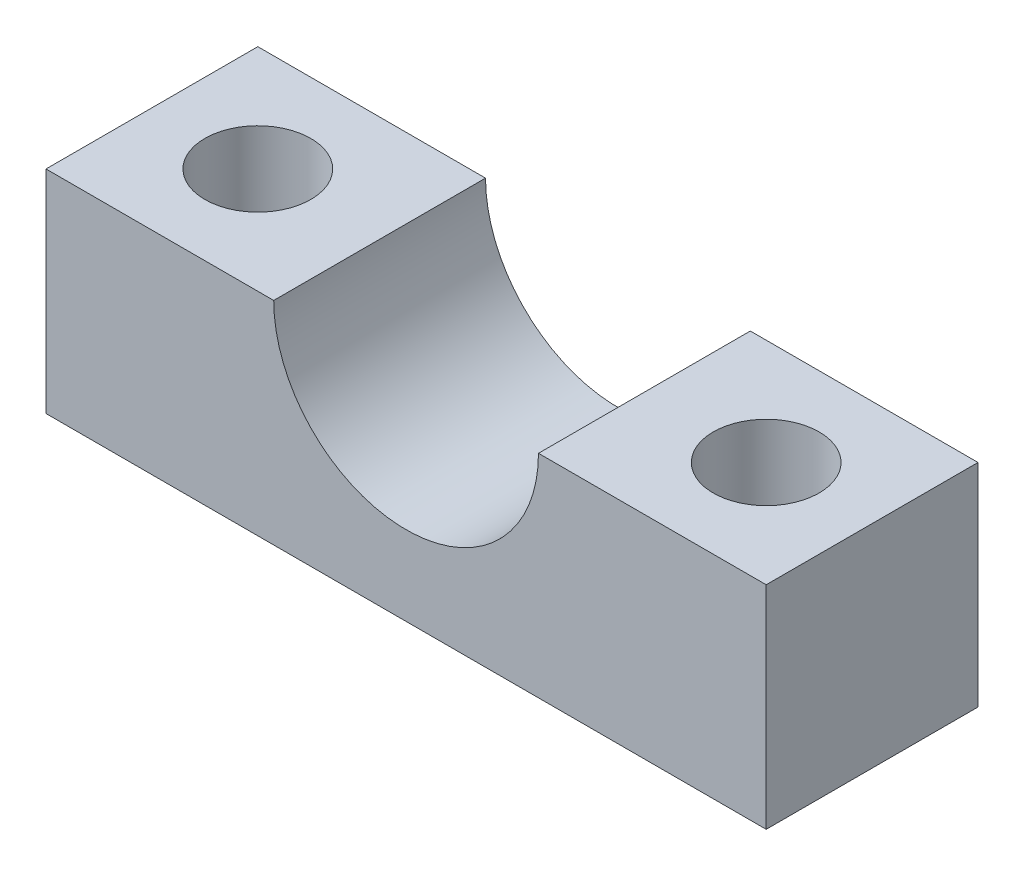
ISO-10303-21;
HEADER;
FILE_DESCRIPTION(('STEP AP214'),'2;1');
FILE_NAME('part.step','',(''),(''),'','','');
FILE_SCHEMA(('AUTOMOTIVE_DESIGN { 1 0 10303 214 1 1 1 1 }'));
ENDSEC;
DATA;
#1=APPLICATION_CONTEXT('core data for automotive mechanical design processes');
#2=APPLICATION_PROTOCOL_DEFINITION('international standard','automotive_design',2000,#1);
#3=PRODUCT_CONTEXT('',#1,'mechanical');
#4=PRODUCT('Part','Part','',(#3));
#5=PRODUCT_RELATED_PRODUCT_CATEGORY('part','',(#4));
#6=PRODUCT_DEFINITION_FORMATION('','',#4);
#7=PRODUCT_DEFINITION_CONTEXT('part definition',#1,'design');
#8=PRODUCT_DEFINITION('design','',#6,#7);
#9=PRODUCT_DEFINITION_SHAPE('','',#8);
#10=(LENGTH_UNIT() NAMED_UNIT(*) SI_UNIT(.MILLI.,.METRE.));
#11=(NAMED_UNIT(*) PLANE_ANGLE_UNIT() SI_UNIT($,.RADIAN.));
#12=(NAMED_UNIT(*) SI_UNIT($,.STERADIAN.) SOLID_ANGLE_UNIT());
#13=UNCERTAINTY_MEASURE_WITH_UNIT(LENGTH_MEASURE(1.E-05),#10,'distance_accuracy_value','');
#14=(GEOMETRIC_REPRESENTATION_CONTEXT(3) GLOBAL_UNCERTAINTY_ASSIGNED_CONTEXT((#13)) GLOBAL_UNIT_ASSIGNED_CONTEXT((#10,
#11,#12)) REPRESENTATION_CONTEXT('',''));
#15=CARTESIAN_POINT('',(0.,0.,0.));
#16=DIRECTION('',(0.,0.,1.));
#17=DIRECTION('',(1.,0.,0.));
#18=AXIS2_PLACEMENT_3D('',#15,#16,#17);
#19=CARTESIAN_POINT('',(0.,12.7,0.));
#20=DIRECTION('',(0.,1.,0.));
#21=DIRECTION('',(0.,0.,1.));
#22=AXIS2_PLACEMENT_3D('',#19,#20,#21);
#23=PLANE('',#22);
#24=DIRECTION('',(0.,0.,1.));
#25=VECTOR('',#24,1.);
#26=CARTESIAN_POINT('',(-7.9375,12.7,-6.35));
#27=LINE('',#26,#25);
#28=CARTESIAN_POINT('',(-7.9375,12.7,-6.35));
#29=VERTEX_POINT('',#28);
#30=CARTESIAN_POINT('',(-7.9375,12.7,6.35));
#31=VERTEX_POINT('',#30);
#32=EDGE_CURVE('E101',#29,#31,#27,.T.);
#33=ORIENTED_EDGE('',*,*,#32,.F.);
#34=DIRECTION('',(-1.,0.,0.));
#35=VECTOR('',#34,1.);
#36=CARTESIAN_POINT('',(21.59,12.7,-6.35));
#37=LINE('',#36,#35);
#38=CARTESIAN_POINT('',(-21.59,12.7,-6.35));
#39=VERTEX_POINT('',#38);
#40=EDGE_CURVE('E62',#29,#39,#37,.T.);
#41=ORIENTED_EDGE('',*,*,#40,.T.);
#42=DIRECTION('',(0.,0.,1.));
#43=VECTOR('',#42,1.);
#44=CARTESIAN_POINT('',(-21.59,12.7,6.35));
#45=LINE('',#44,#43);
#46=CARTESIAN_POINT('',(-21.59,12.7,6.35));
#47=VERTEX_POINT('',#46);
#48=EDGE_CURVE('E125',#39,#47,#45,.T.);
#49=ORIENTED_EDGE('',*,*,#48,.T.);
#50=DIRECTION('',(1.,0.,0.));
#51=VECTOR('',#50,1.);
#52=CARTESIAN_POINT('',(21.59,12.7,6.35));
#53=LINE('',#52,#51);
#54=EDGE_CURVE('E92',#47,#31,#53,.T.);
#55=ORIENTED_EDGE('',*,*,#54,.T.);
#56=EDGE_LOOP('',(#33,#41,#49,#55));
#57=FACE_BOUND('',#56,.T.);
#58=CARTESIAN_POINT('',(-15.24,12.7,0.));
#59=DIRECTION('',(0.,1.,0.));
#60=DIRECTION('',(0.,0.,1.));
#61=AXIS2_PLACEMENT_3D('',#58,#59,#60);
#62=CIRCLE('',#61,3.175);
#63=CARTESIAN_POINT('',(-15.24,12.7,3.175));
#64=VERTEX_POINT('',#63);
#65=EDGE_CURVE('E120',#64,#64,#62,.T.);
#66=ORIENTED_EDGE('',*,*,#65,.F.);
#67=EDGE_LOOP('',(#66));
#68=FACE_BOUND('',#67,.T.);
#69=ADVANCED_FACE('F39',(#57,#68),#23,.T.);
#70=DIRECTION('',(0.,0.,1.));
#71=VECTOR('',#70,1.);
#72=CARTESIAN_POINT('',(7.9375,12.7,-6.35));
#73=LINE('',#72,#71);
#74=CARTESIAN_POINT('',(7.9375,12.7,6.35));
#75=VERTEX_POINT('',#74);
#76=CARTESIAN_POINT('',(7.9375,12.7,-6.35));
#77=VERTEX_POINT('',#76);
#78=EDGE_CURVE('E54',#75,#77,#73,.F.);
#79=ORIENTED_EDGE('',*,*,#78,.F.);
#80=CARTESIAN_POINT('',(21.59,12.7,6.35));
#81=VERTEX_POINT('',#80);
#82=EDGE_CURVE('E148',#75,#81,#53,.T.);
#83=ORIENTED_EDGE('',*,*,#82,.T.);
#84=DIRECTION('',(0.,0.,-1.));
#85=VECTOR('',#84,1.);
#86=CARTESIAN_POINT('',(21.59,12.7,6.35));
#87=LINE('',#86,#85);
#88=CARTESIAN_POINT('',(21.59,12.7,-6.35));
#89=VERTEX_POINT('',#88);
#90=EDGE_CURVE('E111',#81,#89,#87,.T.);
#91=ORIENTED_EDGE('',*,*,#90,.T.);
#92=EDGE_CURVE('E110',#89,#77,#37,.T.);
#93=ORIENTED_EDGE('',*,*,#92,.T.);
#94=EDGE_LOOP('',(#79,#83,#91,#93));
#95=FACE_BOUND('',#94,.T.);
#96=CARTESIAN_POINT('',(15.24,12.7,0.));
#97=DIRECTION('',(0.,1.,0.));
#98=DIRECTION('',(0.,0.,-1.));
#99=AXIS2_PLACEMENT_3D('',#96,#97,#98);
#100=CIRCLE('',#99,3.175);
#101=CARTESIAN_POINT('',(15.24,12.7,-3.17500000000001));
#102=VERTEX_POINT('',#101);
#103=EDGE_CURVE('E154',#102,#102,#100,.T.);
#104=ORIENTED_EDGE('',*,*,#103,.F.);
#105=EDGE_LOOP('',(#104));
#106=FACE_BOUND('',#105,.T.);
#107=ADVANCED_FACE('F146',(#95,#106),#23,.T.);
#108=CARTESIAN_POINT('',(0.,0.,0.));
#109=DIRECTION('',(0.,1.,0.));
#110=DIRECTION('',(0.,0.,1.));
#111=AXIS2_PLACEMENT_3D('',#108,#109,#110);
#112=PLANE('',#111);
#113=DIRECTION('',(0.,0.,1.));
#114=VECTOR('',#113,1.);
#115=CARTESIAN_POINT('',(-21.59,0.,6.35));
#116=LINE('',#115,#114);
#117=CARTESIAN_POINT('',(-21.59,0.,-6.35));
#118=VERTEX_POINT('',#117);
#119=CARTESIAN_POINT('',(-21.59,0.,6.35));
#120=VERTEX_POINT('',#119);
#121=EDGE_CURVE('E116',#118,#120,#116,.T.);
#122=ORIENTED_EDGE('',*,*,#121,.F.);
#123=DIRECTION('',(-1.,0.,0.));
#124=VECTOR('',#123,1.);
#125=CARTESIAN_POINT('',(21.59,0.,-6.35));
#126=LINE('',#125,#124);
#127=CARTESIAN_POINT('',(21.59,0.,-6.35));
#128=VERTEX_POINT('',#127);
#129=EDGE_CURVE('E84',#128,#118,#126,.T.);
#130=ORIENTED_EDGE('',*,*,#129,.F.);
#131=DIRECTION('',(0.,0.,-1.));
#132=VECTOR('',#131,1.);
#133=CARTESIAN_POINT('',(21.59,0.,6.35));
#134=LINE('',#133,#132);
#135=CARTESIAN_POINT('',(21.59,0.,6.35));
#136=VERTEX_POINT('',#135);
#137=EDGE_CURVE('E122',#136,#128,#134,.T.);
#138=ORIENTED_EDGE('',*,*,#137,.F.);
#139=DIRECTION('',(1.,0.,0.));
#140=VECTOR('',#139,1.);
#141=CARTESIAN_POINT('',(21.59,0.,6.35));
#142=LINE('',#141,#140);
#143=EDGE_CURVE('E119',#120,#136,#142,.T.);
#144=ORIENTED_EDGE('',*,*,#143,.F.);
#145=EDGE_LOOP('',(#122,#130,#138,#144));
#146=FACE_BOUND('',#145,.T.);
#147=CARTESIAN_POINT('',(-15.24,0.,0.));
#148=DIRECTION('',(0.,1.,0.));
#149=DIRECTION('',(0.,0.,1.));
#150=AXIS2_PLACEMENT_3D('',#147,#148,#149);
#151=CIRCLE('',#150,3.175);
#152=CARTESIAN_POINT('',(-15.24,0.,3.175));
#153=VERTEX_POINT('',#152);
#154=EDGE_CURVE('E151',#153,#153,#151,.T.);
#155=ORIENTED_EDGE('',*,*,#154,.T.);
#156=EDGE_LOOP('',(#155));
#157=FACE_BOUND('',#156,.T.);
#158=CARTESIAN_POINT('',(15.24,0.,0.));
#159=DIRECTION('',(0.,1.,0.));
#160=DIRECTION('',(0.,0.,-1.));
#161=AXIS2_PLACEMENT_3D('',#158,#159,#160);
#162=CIRCLE('',#161,3.175);
#163=CARTESIAN_POINT('',(15.24,0.,-3.17500000000001));
#164=VERTEX_POINT('',#163);
#165=EDGE_CURVE('E105',#164,#164,#162,.T.);
#166=ORIENTED_EDGE('',*,*,#165,.T.);
#167=EDGE_LOOP('',(#166));
#168=FACE_BOUND('',#167,.T.);
#169=ADVANCED_FACE('F138',(#146,#157,#168),#112,.F.);
#170=CARTESIAN_POINT('',(-21.59,12.7,6.35));
#171=DIRECTION('',(1.,0.,0.));
#172=DIRECTION('',(0.,0.,-1.));
#173=AXIS2_PLACEMENT_3D('',#170,#171,#172);
#174=PLANE('',#173);
#175=ORIENTED_EDGE('',*,*,#121,.T.);
#176=DIRECTION('',(0.,-1.,0.));
#177=VECTOR('',#176,1.);
#178=CARTESIAN_POINT('',(-21.59,12.7,6.35));
#179=LINE('',#178,#177);
#180=EDGE_CURVE('E47',#47,#120,#179,.T.);
#181=ORIENTED_EDGE('',*,*,#180,.F.);
#182=ORIENTED_EDGE('',*,*,#48,.F.);
#183=DIRECTION('',(0.,-1.,0.));
#184=VECTOR('',#183,1.);
#185=CARTESIAN_POINT('',(-21.59,12.7,-6.35));
#186=LINE('',#185,#184);
#187=EDGE_CURVE('E108',#39,#118,#186,.T.);
#188=ORIENTED_EDGE('',*,*,#187,.T.);
#189=EDGE_LOOP('',(#175,#181,#182,#188));
#190=FACE_BOUND('',#189,.T.);
#191=ADVANCED_FACE('F41',(#190),#174,.F.);
#192=CARTESIAN_POINT('',(21.59,12.7,6.35));
#193=DIRECTION('',(0.,0.,-1.));
#194=DIRECTION('',(-1.,0.,0.));
#195=AXIS2_PLACEMENT_3D('',#192,#193,#194);
#196=PLANE('',#195);
#197=ORIENTED_EDGE('',*,*,#82,.F.);
#198=CARTESIAN_POINT('',(0.,12.7,6.35));
#199=DIRECTION('',(0.,0.,1.));
#200=DIRECTION('',(1.,0.,0.));
#201=AXIS2_PLACEMENT_3D('',#198,#199,#200);
#202=CIRCLE('',#201,7.9375);
#203=EDGE_CURVE('E162',#31,#75,#202,.T.);
#204=ORIENTED_EDGE('',*,*,#203,.F.);
#205=ORIENTED_EDGE('',*,*,#54,.F.);
#206=ORIENTED_EDGE('',*,*,#180,.T.);
#207=ORIENTED_EDGE('',*,*,#143,.T.);
#208=DIRECTION('',(0.,-1.,0.));
#209=VECTOR('',#208,1.);
#210=CARTESIAN_POINT('',(21.59,12.7,6.35));
#211=LINE('',#210,#209);
#212=EDGE_CURVE('E129',#81,#136,#211,.T.);
#213=ORIENTED_EDGE('',*,*,#212,.F.);
#214=EDGE_LOOP('',(#197,#204,#205,#206,#207,#213));
#215=FACE_BOUND('',#214,.T.);
#216=ADVANCED_FACE('F133',(#215),#196,.F.);
#217=CARTESIAN_POINT('',(21.59,12.7,6.35));
#218=DIRECTION('',(-1.,0.,0.));
#219=DIRECTION('',(0.,0.,1.));
#220=AXIS2_PLACEMENT_3D('',#217,#218,#219);
#221=PLANE('',#220);
#222=ORIENTED_EDGE('',*,*,#137,.T.);
#223=DIRECTION('',(0.,-1.,0.));
#224=VECTOR('',#223,1.);
#225=CARTESIAN_POINT('',(21.59,12.7,-6.35));
#226=LINE('',#225,#224);
#227=EDGE_CURVE('E127',#89,#128,#226,.T.);
#228=ORIENTED_EDGE('',*,*,#227,.F.);
#229=ORIENTED_EDGE('',*,*,#90,.F.);
#230=ORIENTED_EDGE('',*,*,#212,.T.);
#231=EDGE_LOOP('',(#222,#228,#229,#230));
#232=FACE_BOUND('',#231,.T.);
#233=ADVANCED_FACE('F143',(#232),#221,.F.);
#234=CARTESIAN_POINT('',(21.59,12.7,-6.35));
#235=DIRECTION('',(0.,0.,1.));
#236=DIRECTION('',(1.,0.,0.));
#237=AXIS2_PLACEMENT_3D('',#234,#235,#236);
#238=PLANE('',#237);
#239=ORIENTED_EDGE('',*,*,#40,.F.);
#240=CARTESIAN_POINT('',(0.,12.7,-6.35));
#241=DIRECTION('',(0.,0.,1.));
#242=DIRECTION('',(1.,0.,0.));
#243=AXIS2_PLACEMENT_3D('',#240,#241,#242);
#244=CIRCLE('',#243,7.9375);
#245=EDGE_CURVE('E11',#29,#77,#244,.T.);
#246=ORIENTED_EDGE('',*,*,#245,.T.);
#247=ORIENTED_EDGE('',*,*,#92,.F.);
#248=ORIENTED_EDGE('',*,*,#227,.T.);
#249=ORIENTED_EDGE('',*,*,#129,.T.);
#250=ORIENTED_EDGE('',*,*,#187,.F.);
#251=EDGE_LOOP('',(#239,#246,#247,#248,#249,#250));
#252=FACE_BOUND('',#251,.T.);
#253=ADVANCED_FACE('F107',(#252),#238,.F.);
#254=CARTESIAN_POINT('',(-15.24,12.7,0.));
#255=DIRECTION('',(0.,-1.,0.));
#256=DIRECTION('',(0.,0.,-1.));
#257=AXIS2_PLACEMENT_3D('',#254,#255,#256);
#258=CYLINDRICAL_SURFACE('',#257,3.175);
#259=ORIENTED_EDGE('',*,*,#65,.T.);
#260=EDGE_LOOP('',(#259));
#261=FACE_BOUND('',#260,.T.);
#262=ORIENTED_EDGE('',*,*,#154,.F.);
#263=EDGE_LOOP('',(#262));
#264=FACE_BOUND('',#263,.T.);
#265=ADVANCED_FACE('F176',(#261,#264),#258,.F.);
#266=CARTESIAN_POINT('',(15.24,12.7,0.));
#267=DIRECTION('',(0.,-1.,0.));
#268=DIRECTION('',(0.,0.,-1.));
#269=AXIS2_PLACEMENT_3D('',#266,#267,#268);
#270=CYLINDRICAL_SURFACE('',#269,3.175);
#271=ORIENTED_EDGE('',*,*,#103,.T.);
#272=EDGE_LOOP('',(#271));
#273=FACE_BOUND('',#272,.T.);
#274=ORIENTED_EDGE('',*,*,#165,.F.);
#275=EDGE_LOOP('',(#274));
#276=FACE_BOUND('',#275,.T.);
#277=ADVANCED_FACE('F165',(#273,#276),#270,.F.);
#278=CARTESIAN_POINT('',(0.,12.7,-6.35));
#279=DIRECTION('',(0.,0.,1.));
#280=DIRECTION('',(1.,0.,0.));
#281=AXIS2_PLACEMENT_3D('',#278,#279,#280);
#282=CYLINDRICAL_SURFACE('',#281,7.9375);
#283=ORIENTED_EDGE('',*,*,#32,.T.);
#284=ORIENTED_EDGE('',*,*,#203,.T.);
#285=ORIENTED_EDGE('',*,*,#78,.T.);
#286=ORIENTED_EDGE('',*,*,#245,.F.);
#287=EDGE_LOOP('',(#283,#284,#285,#286));
#288=FACE_BOUND('',#287,.T.);
#289=ADVANCED_FACE('F100',(#288),#282,.F.);
#290=CLOSED_SHELL('',(#69,#107,#169,#191,#216,#233,#253,#265,#277,#289));
#291=MANIFOLD_SOLID_BREP('B2',#290);
#292=ADVANCED_BREP_SHAPE_REPRESENTATION('',(#18,#291),#14);
#293=SHAPE_DEFINITION_REPRESENTATION(#9,#292);
ENDSEC;
END-ISO-10303-21;
